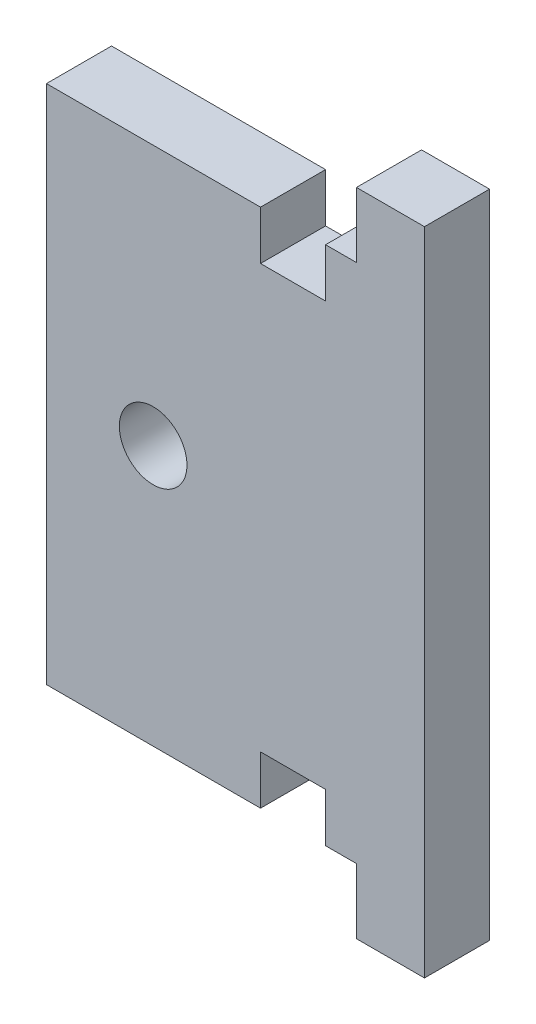
ISO-10303-21;
HEADER;
FILE_DESCRIPTION(('STEP AP214'),'2;1');
FILE_NAME('part.step','',(''),(''),'','','');
FILE_SCHEMA(('AUTOMOTIVE_DESIGN { 1 0 10303 214 1 1 1 1 }'));
ENDSEC;
DATA;
#1=APPLICATION_CONTEXT('core data for automotive mechanical design processes');
#2=APPLICATION_PROTOCOL_DEFINITION('international standard','automotive_design',2000,#1);
#3=PRODUCT_CONTEXT('',#1,'mechanical');
#4=PRODUCT('Part','Part','',(#3));
#5=PRODUCT_RELATED_PRODUCT_CATEGORY('part','',(#4));
#6=PRODUCT_DEFINITION_FORMATION('','',#4);
#7=PRODUCT_DEFINITION_CONTEXT('part definition',#1,'design');
#8=PRODUCT_DEFINITION('design','',#6,#7);
#9=PRODUCT_DEFINITION_SHAPE('','',#8);
#10=(LENGTH_UNIT() NAMED_UNIT(*) SI_UNIT(.MILLI.,.METRE.));
#11=(NAMED_UNIT(*) PLANE_ANGLE_UNIT() SI_UNIT($,.RADIAN.));
#12=(NAMED_UNIT(*) SI_UNIT($,.STERADIAN.) SOLID_ANGLE_UNIT());
#13=UNCERTAINTY_MEASURE_WITH_UNIT(LENGTH_MEASURE(1.E-05),#10,'distance_accuracy_value','');
#14=(GEOMETRIC_REPRESENTATION_CONTEXT(3) GLOBAL_UNCERTAINTY_ASSIGNED_CONTEXT((#13)) GLOBAL_UNIT_ASSIGNED_CONTEXT((#10,
#11,#12)) REPRESENTATION_CONTEXT('',''));
#15=CARTESIAN_POINT('',(0.,0.,0.));
#16=DIRECTION('',(0.,0.,1.));
#17=DIRECTION('',(1.,0.,0.));
#18=AXIS2_PLACEMENT_3D('',#15,#16,#17);
#19=CARTESIAN_POINT('',(0.,6.34999999999999,0.));
#20=DIRECTION('',(0.,1.,0.));
#21=DIRECTION('',(-1.,0.,0.));
#22=AXIS2_PLACEMENT_3D('',#19,#20,#21);
#23=PLANE('',#22);
#24=DIRECTION('',(-1.,0.,0.));
#25=VECTOR('',#24,1.);
#26=CARTESIAN_POINT('',(0.,6.34999999999999,6.35));
#27=LINE('',#26,#25);
#28=CARTESIAN_POINT('',(37.30625,6.34999999999999,6.35));
#29=VERTEX_POINT('',#28);
#30=CARTESIAN_POINT('',(34.2900000000002,6.35000000000222,6.35));
#31=VERTEX_POINT('',#30);
#32=EDGE_CURVE('E194',#29,#31,#27,.T.);
#33=ORIENTED_EDGE('',*,*,#32,.T.);
#34=DIRECTION('',(0.,0.,1.));
#35=VECTOR('',#34,1.);
#36=CARTESIAN_POINT('',(34.2900000000002,6.35000000000222,0.));
#37=LINE('',#36,#35);
#38=CARTESIAN_POINT('',(34.2900000000002,6.35000000000222,0.));
#39=VERTEX_POINT('',#38);
#40=EDGE_CURVE('E228',#39,#31,#37,.T.);
#41=ORIENTED_EDGE('',*,*,#40,.F.);
#42=DIRECTION('',(-1.,0.,0.));
#43=VECTOR('',#42,1.);
#44=CARTESIAN_POINT('',(0.,6.34999999999999,0.));
#45=LINE('',#44,#43);
#46=CARTESIAN_POINT('',(37.30625,6.34999999999999,0.));
#47=VERTEX_POINT('',#46);
#48=EDGE_CURVE('E188',#47,#39,#45,.T.);
#49=ORIENTED_EDGE('',*,*,#48,.F.);
#50=DIRECTION('',(0.,0.,1.));
#51=VECTOR('',#50,1.);
#52=CARTESIAN_POINT('',(37.30625,6.34999999999999,0.));
#53=LINE('',#52,#51);
#54=EDGE_CURVE('E187',#47,#29,#53,.T.);
#55=ORIENTED_EDGE('',*,*,#54,.T.);
#56=EDGE_LOOP('',(#33,#41,#49,#55));
#57=FACE_BOUND('',#56,.T.);
#58=ADVANCED_FACE('F33',(#57),#23,.F.);
#59=CARTESIAN_POINT('',(0.,57.1500000000035,0.));
#60=DIRECTION('',(0.,-1.,0.));
#61=DIRECTION('',(1.,0.,0.));
#62=AXIS2_PLACEMENT_3D('',#59,#60,#61);
#63=PLANE('',#62);
#64=DIRECTION('',(1.,0.,0.));
#65=VECTOR('',#64,1.);
#66=CARTESIAN_POINT('',(0.,57.1500000000035,0.));
#67=LINE('',#66,#65);
#68=CARTESIAN_POINT('',(34.2900000000002,57.1500000000034,0.));
#69=VERTEX_POINT('',#68);
#70=CARTESIAN_POINT('',(37.30625,57.1500000000035,0.));
#71=VERTEX_POINT('',#70);
#72=EDGE_CURVE('E213',#69,#71,#67,.T.);
#73=ORIENTED_EDGE('',*,*,#72,.F.);
#74=DIRECTION('',(0.,0.,1.));
#75=VECTOR('',#74,1.);
#76=CARTESIAN_POINT('',(34.2900000000002,57.1500000000034,0.));
#77=LINE('',#76,#75);
#78=CARTESIAN_POINT('',(34.2900000000002,57.1500000000034,6.35));
#79=VERTEX_POINT('',#78);
#80=EDGE_CURVE('E246',#69,#79,#77,.T.);
#81=ORIENTED_EDGE('',*,*,#80,.T.);
#82=DIRECTION('',(1.,0.,0.));
#83=VECTOR('',#82,1.);
#84=CARTESIAN_POINT('',(0.,57.1500000000035,6.35));
#85=LINE('',#84,#83);
#86=CARTESIAN_POINT('',(37.30625,57.1500000000035,6.35));
#87=VERTEX_POINT('',#86);
#88=EDGE_CURVE('E193',#79,#87,#85,.T.);
#89=ORIENTED_EDGE('',*,*,#88,.T.);
#90=DIRECTION('',(0.,0.,1.));
#91=VECTOR('',#90,1.);
#92=CARTESIAN_POINT('',(37.30625,57.1500000000035,0.));
#93=LINE('',#92,#91);
#94=EDGE_CURVE('E184',#71,#87,#93,.T.);
#95=ORIENTED_EDGE('',*,*,#94,.F.);
#96=EDGE_LOOP('',(#73,#81,#89,#95));
#97=FACE_BOUND('',#96,.T.);
#98=ADVANCED_FACE('F281',(#97),#63,.F.);
#99=CARTESIAN_POINT('',(0.,0.,6.35));
#100=DIRECTION('',(0.,1.,0.));
#101=DIRECTION('',(0.,0.,1.));
#102=AXIS2_PLACEMENT_3D('',#99,#100,#101);
#103=PLANE('',#102);
#104=DIRECTION('',(0.,0.,1.));
#105=VECTOR('',#104,1.);
#106=CARTESIAN_POINT('',(37.30625,0.,0.));
#107=LINE('',#106,#105);
#108=CARTESIAN_POINT('',(37.30625,0.,0.));
#109=VERTEX_POINT('',#108);
#110=CARTESIAN_POINT('',(37.30625,0.,6.35));
#111=VERTEX_POINT('',#110);
#112=EDGE_CURVE('E185',#109,#111,#107,.T.);
#113=ORIENTED_EDGE('',*,*,#112,.F.);
#114=DIRECTION('',(1.,0.,0.));
#115=VECTOR('',#114,1.);
#116=CARTESIAN_POINT('',(0.,0.,0.));
#117=LINE('',#116,#115);
#118=CARTESIAN_POINT('',(43.942,0.,0.));
#119=VERTEX_POINT('',#118);
#120=EDGE_CURVE('E167',#109,#119,#117,.T.);
#121=ORIENTED_EDGE('',*,*,#120,.T.);
#122=DIRECTION('',(0.,0.,-1.));
#123=VECTOR('',#122,1.);
#124=CARTESIAN_POINT('',(43.942,0.,6.35));
#125=LINE('',#124,#123);
#126=CARTESIAN_POINT('',(43.942,0.,6.35));
#127=VERTEX_POINT('',#126);
#128=EDGE_CURVE('E11',#127,#119,#125,.T.);
#129=ORIENTED_EDGE('',*,*,#128,.F.);
#130=DIRECTION('',(1.,0.,0.));
#131=VECTOR('',#130,1.);
#132=CARTESIAN_POINT('',(0.,0.,6.35));
#133=LINE('',#132,#131);
#134=EDGE_CURVE('E166',#111,#127,#133,.T.);
#135=ORIENTED_EDGE('',*,*,#134,.F.);
#136=EDGE_LOOP('',(#113,#121,#129,#135));
#137=FACE_BOUND('',#136,.T.);
#138=ADVANCED_FACE('F35',(#137),#103,.F.);
#139=CARTESIAN_POINT('',(0.,0.,6.35));
#140=DIRECTION('',(0.,0.,-1.));
#141=DIRECTION('',(-1.,0.,0.));
#142=AXIS2_PLACEMENT_3D('',#139,#140,#141);
#143=PLANE('',#142);
#144=CARTESIAN_POINT('',(17.4625000000023,31.7500000000036,6.35));
#145=DIRECTION('',(0.,0.,1.));
#146=DIRECTION('',(1.,0.,0.));
#147=AXIS2_PLACEMENT_3D('',#144,#145,#146);
#148=CIRCLE('',#147,3.29999999999999);
#149=CARTESIAN_POINT('',(20.7625000000023,31.7500000000036,6.35));
#150=VERTEX_POINT('',#149);
#151=EDGE_CURVE('E175',#150,#150,#148,.T.);
#152=ORIENTED_EDGE('',*,*,#151,.F.);
#153=EDGE_LOOP('',(#152));
#154=FACE_BOUND('',#153,.T.);
#155=DIRECTION('',(0.,1.,0.));
#156=VECTOR('',#155,1.);
#157=CARTESIAN_POINT('',(43.942,0.,6.35));
#158=LINE('',#157,#156);
#159=CARTESIAN_POINT('',(43.942,63.5,6.35));
#160=VERTEX_POINT('',#159);
#161=EDGE_CURVE('E41',#127,#160,#158,.T.);
#162=ORIENTED_EDGE('',*,*,#161,.T.);
#163=DIRECTION('',(-1.,0.,0.));
#164=VECTOR('',#163,1.);
#165=CARTESIAN_POINT('',(0.,63.5,6.35));
#166=LINE('',#165,#164);
#167=CARTESIAN_POINT('',(37.30625,63.5,6.35));
#168=VERTEX_POINT('',#167);
#169=EDGE_CURVE('E147',#160,#168,#166,.T.);
#170=ORIENTED_EDGE('',*,*,#169,.T.);
#171=DIRECTION('',(0.,-1.,0.));
#172=VECTOR('',#171,1.);
#173=CARTESIAN_POINT('',(37.30625,0.,6.35));
#174=LINE('',#173,#172);
#175=EDGE_CURVE('E211',#168,#87,#174,.T.);
#176=ORIENTED_EDGE('',*,*,#175,.T.);
#177=ORIENTED_EDGE('',*,*,#88,.F.);
#178=DIRECTION('',(0.,1.,0.));
#179=VECTOR('',#178,1.);
#180=CARTESIAN_POINT('',(34.2900000000002,57.1500000000034,6.35));
#181=LINE('',#180,#179);
#182=CARTESIAN_POINT('',(34.2900000000002,52.3875000000034,6.35));
#183=VERTEX_POINT('',#182);
#184=EDGE_CURVE('E230',#183,#79,#181,.T.);
#185=ORIENTED_EDGE('',*,*,#184,.F.);
#186=DIRECTION('',(1.,0.,0.));
#187=VECTOR('',#186,1.);
#188=CARTESIAN_POINT('',(34.2900000000002,52.3875000000034,6.35));
#189=LINE('',#188,#187);
#190=CARTESIAN_POINT('',(27.9400000000002,52.3875000000034,6.35));
#191=VERTEX_POINT('',#190);
#192=EDGE_CURVE('E255',#191,#183,#189,.T.);
#193=ORIENTED_EDGE('',*,*,#192,.F.);
#194=DIRECTION('',(0.,-1.,0.));
#195=VECTOR('',#194,1.);
#196=CARTESIAN_POINT('',(27.9400000000002,57.1500000000034,6.35));
#197=LINE('',#196,#195);
#198=CARTESIAN_POINT('',(27.9400000000002,57.1500000000034,6.35));
#199=VERTEX_POINT('',#198);
#200=EDGE_CURVE('E259',#199,#191,#197,.T.);
#201=ORIENTED_EDGE('',*,*,#200,.F.);
#202=CARTESIAN_POINT('',(7.05050000000001,57.1500000000035,6.35));
#203=VERTEX_POINT('',#202);
#204=EDGE_CURVE('E214',#203,#199,#85,.T.);
#205=ORIENTED_EDGE('',*,*,#204,.F.);
#206=DIRECTION('',(0.,1.,0.));
#207=VECTOR('',#206,1.);
#208=CARTESIAN_POINT('',(7.05050000000002,0.,6.35));
#209=LINE('',#208,#207);
#210=CARTESIAN_POINT('',(7.05050000000002,6.34999999999999,6.35));
#211=VERTEX_POINT('',#210);
#212=EDGE_CURVE('E178',#211,#203,#209,.T.);
#213=ORIENTED_EDGE('',*,*,#212,.F.);
#214=CARTESIAN_POINT('',(27.9400000000002,6.34999999999999,6.35));
#215=VERTEX_POINT('',#214);
#216=EDGE_CURVE('E198',#215,#211,#27,.T.);
#217=ORIENTED_EDGE('',*,*,#216,.F.);
#218=DIRECTION('',(0.,-1.,0.));
#219=VECTOR('',#218,1.);
#220=CARTESIAN_POINT('',(27.9400000000002,11.1125000000022,6.35));
#221=LINE('',#220,#219);
#222=CARTESIAN_POINT('',(27.9400000000002,11.1125000000022,6.35));
#223=VERTEX_POINT('',#222);
#224=EDGE_CURVE('E56',#223,#215,#221,.T.);
#225=ORIENTED_EDGE('',*,*,#224,.F.);
#226=DIRECTION('',(-1.,0.,0.));
#227=VECTOR('',#226,1.);
#228=CARTESIAN_POINT('',(34.2900000000002,11.1125000000022,6.35));
#229=LINE('',#228,#227);
#230=CARTESIAN_POINT('',(34.2900000000002,11.1125000000022,6.35));
#231=VERTEX_POINT('',#230);
#232=EDGE_CURVE('E233',#231,#223,#229,.T.);
#233=ORIENTED_EDGE('',*,*,#232,.F.);
#234=DIRECTION('',(0.,1.,0.));
#235=VECTOR('',#234,1.);
#236=CARTESIAN_POINT('',(34.2900000000002,11.1125000000022,6.35));
#237=LINE('',#236,#235);
#238=EDGE_CURVE('E236',#31,#231,#237,.T.);
#239=ORIENTED_EDGE('',*,*,#238,.F.);
#240=ORIENTED_EDGE('',*,*,#32,.F.);
#241=DIRECTION('',(0.,-1.,0.));
#242=VECTOR('',#241,1.);
#243=CARTESIAN_POINT('',(37.30625,0.,6.35));
#244=LINE('',#243,#242);
#245=EDGE_CURVE('E199',#29,#111,#244,.T.);
#246=ORIENTED_EDGE('',*,*,#245,.T.);
#247=ORIENTED_EDGE('',*,*,#134,.T.);
#248=EDGE_LOOP('',(#162,#170,#176,#177,#185,#193,#201,#205,#213,#217,#225,#233,#239,#240,#246,#247));
#249=FACE_BOUND('',#248,.T.);
#250=ADVANCED_FACE('F274',(#154,#249),#143,.F.);
#251=CARTESIAN_POINT('',(0.,0.,0.));
#252=DIRECTION('',(0.,0.,-1.));
#253=DIRECTION('',(-1.,0.,0.));
#254=AXIS2_PLACEMENT_3D('',#251,#252,#253);
#255=PLANE('',#254);
#256=DIRECTION('',(1.,0.,0.));
#257=VECTOR('',#256,1.);
#258=CARTESIAN_POINT('',(0.,63.5,0.));
#259=LINE('',#258,#257);
#260=CARTESIAN_POINT('',(37.30625,63.5,0.));
#261=VERTEX_POINT('',#260);
#262=CARTESIAN_POINT('',(43.942,63.5,0.));
#263=VERTEX_POINT('',#262);
#264=EDGE_CURVE('E48',#261,#263,#259,.T.);
#265=ORIENTED_EDGE('',*,*,#264,.T.);
#266=DIRECTION('',(0.,1.,0.));
#267=VECTOR('',#266,1.);
#268=CARTESIAN_POINT('',(43.942,0.,0.));
#269=LINE('',#268,#267);
#270=EDGE_CURVE('E160',#119,#263,#269,.T.);
#271=ORIENTED_EDGE('',*,*,#270,.F.);
#272=ORIENTED_EDGE('',*,*,#120,.F.);
#273=DIRECTION('',(0.,-1.,0.));
#274=VECTOR('',#273,1.);
#275=CARTESIAN_POINT('',(37.30625,0.,0.));
#276=LINE('',#275,#274);
#277=EDGE_CURVE('E197',#47,#109,#276,.T.);
#278=ORIENTED_EDGE('',*,*,#277,.F.);
#279=ORIENTED_EDGE('',*,*,#48,.T.);
#280=DIRECTION('',(0.,1.,0.));
#281=VECTOR('',#280,1.);
#282=CARTESIAN_POINT('',(34.2900000000002,11.1125000000022,0.));
#283=LINE('',#282,#281);
#284=CARTESIAN_POINT('',(34.2900000000002,11.1125000000022,0.));
#285=VERTEX_POINT('',#284);
#286=EDGE_CURVE('E232',#39,#285,#283,.T.);
#287=ORIENTED_EDGE('',*,*,#286,.T.);
#288=DIRECTION('',(-1.,0.,0.));
#289=VECTOR('',#288,1.);
#290=CARTESIAN_POINT('',(34.2900000000002,11.1125000000022,0.));
#291=LINE('',#290,#289);
#292=CARTESIAN_POINT('',(27.9400000000002,11.1125000000022,0.));
#293=VERTEX_POINT('',#292);
#294=EDGE_CURVE('E241',#285,#293,#291,.T.);
#295=ORIENTED_EDGE('',*,*,#294,.T.);
#296=DIRECTION('',(0.,-1.,0.));
#297=VECTOR('',#296,1.);
#298=CARTESIAN_POINT('',(27.9400000000002,11.1125000000022,0.));
#299=LINE('',#298,#297);
#300=CARTESIAN_POINT('',(27.9400000000002,6.35000000000221,0.));
#301=VERTEX_POINT('',#300);
#302=EDGE_CURVE('E224',#293,#301,#299,.T.);
#303=ORIENTED_EDGE('',*,*,#302,.T.);
#304=CARTESIAN_POINT('',(7.05050000000002,6.34999999999999,0.));
#305=VERTEX_POINT('',#304);
#306=EDGE_CURVE('E205',#301,#305,#45,.T.);
#307=ORIENTED_EDGE('',*,*,#306,.T.);
#308=DIRECTION('',(0.,-1.,0.));
#309=VECTOR('',#308,1.);
#310=CARTESIAN_POINT('',(7.05050000000002,0.,0.));
#311=LINE('',#310,#309);
#312=CARTESIAN_POINT('',(7.05050000000001,57.1500000000035,0.));
#313=VERTEX_POINT('',#312);
#314=EDGE_CURVE('E181',#313,#305,#311,.T.);
#315=ORIENTED_EDGE('',*,*,#314,.F.);
#316=CARTESIAN_POINT('',(27.9400000000002,57.1500000000035,0.));
#317=VERTEX_POINT('',#316);
#318=EDGE_CURVE('E218',#313,#317,#67,.T.);
#319=ORIENTED_EDGE('',*,*,#318,.T.);
#320=DIRECTION('',(0.,-1.,0.));
#321=VECTOR('',#320,1.);
#322=CARTESIAN_POINT('',(27.9400000000002,57.1500000000034,0.));
#323=LINE('',#322,#321);
#324=CARTESIAN_POINT('',(27.9400000000002,52.3875000000034,0.));
#325=VERTEX_POINT('',#324);
#326=EDGE_CURVE('E265',#317,#325,#323,.T.);
#327=ORIENTED_EDGE('',*,*,#326,.T.);
#328=DIRECTION('',(1.,0.,0.));
#329=VECTOR('',#328,1.);
#330=CARTESIAN_POINT('',(34.2900000000002,52.3875000000034,0.));
#331=LINE('',#330,#329);
#332=CARTESIAN_POINT('',(34.2900000000002,52.3875000000034,0.));
#333=VERTEX_POINT('',#332);
#334=EDGE_CURVE('E250',#325,#333,#331,.T.);
#335=ORIENTED_EDGE('',*,*,#334,.T.);
#336=DIRECTION('',(0.,1.,0.));
#337=VECTOR('',#336,1.);
#338=CARTESIAN_POINT('',(34.2900000000002,57.1500000000034,0.));
#339=LINE('',#338,#337);
#340=EDGE_CURVE('E258',#333,#69,#339,.T.);
#341=ORIENTED_EDGE('',*,*,#340,.T.);
#342=ORIENTED_EDGE('',*,*,#72,.T.);
#343=DIRECTION('',(0.,-1.,0.));
#344=VECTOR('',#343,1.);
#345=CARTESIAN_POINT('',(37.30625,0.,0.));
#346=LINE('',#345,#344);
#347=EDGE_CURVE('E162',#261,#71,#346,.T.);
#348=ORIENTED_EDGE('',*,*,#347,.F.);
#349=EDGE_LOOP('',(#265,#271,#272,#278,#279,#287,#295,#303,#307,#315,#319,#327,#335,#341,#342,#348));
#350=FACE_BOUND('',#349,.T.);
#351=CARTESIAN_POINT('',(17.4625000000023,31.7500000000036,0.));
#352=DIRECTION('',(0.,0.,1.));
#353=DIRECTION('',(1.,0.,0.));
#354=AXIS2_PLACEMENT_3D('',#351,#352,#353);
#355=CIRCLE('',#354,3.3);
#356=CARTESIAN_POINT('',(20.7625000000023,31.7500000000036,0.));
#357=VERTEX_POINT('',#356);
#358=EDGE_CURVE('E169',#357,#357,#355,.T.);
#359=ORIENTED_EDGE('',*,*,#358,.T.);
#360=EDGE_LOOP('',(#359));
#361=FACE_BOUND('',#360,.T.);
#362=ADVANCED_FACE('F157',(#350,#361),#255,.T.);
#363=CARTESIAN_POINT('',(43.942,0.,6.35));
#364=DIRECTION('',(-1.,0.,0.));
#365=DIRECTION('',(0.,0.,1.));
#366=AXIS2_PLACEMENT_3D('',#363,#364,#365);
#367=PLANE('',#366);
#368=ORIENTED_EDGE('',*,*,#270,.T.);
#369=DIRECTION('',(0.,0.,1.));
#370=VECTOR('',#369,1.);
#371=CARTESIAN_POINT('',(43.942,63.5,0.));
#372=LINE('',#371,#370);
#373=EDGE_CURVE('E144',#263,#160,#372,.T.);
#374=ORIENTED_EDGE('',*,*,#373,.T.);
#375=ORIENTED_EDGE('',*,*,#161,.F.);
#376=ORIENTED_EDGE('',*,*,#128,.T.);
#377=EDGE_LOOP('',(#368,#374,#375,#376));
#378=FACE_BOUND('',#377,.T.);
#379=ADVANCED_FACE('F164',(#378),#367,.F.);
#380=CARTESIAN_POINT('',(17.4625000000023,31.7500000000036,6.35));
#381=DIRECTION('',(0.,0.,1.));
#382=DIRECTION('',(1.,0.,0.));
#383=AXIS2_PLACEMENT_3D('',#380,#381,#382);
#384=CYLINDRICAL_SURFACE('',#383,3.29999999999999);
#385=ORIENTED_EDGE('',*,*,#358,.F.);
#386=EDGE_LOOP('',(#385));
#387=FACE_BOUND('',#386,.T.);
#388=ORIENTED_EDGE('',*,*,#151,.T.);
#389=EDGE_LOOP('',(#388));
#390=FACE_BOUND('',#389,.T.);
#391=ADVANCED_FACE('F344',(#387,#390),#384,.F.);
#392=CARTESIAN_POINT('',(7.05050000000002,0.,0.));
#393=DIRECTION('',(-1.,0.,0.));
#394=DIRECTION('',(0.,-1.,0.));
#395=AXIS2_PLACEMENT_3D('',#392,#393,#394);
#396=PLANE('',#395);
#397=DIRECTION('',(0.,0.,1.));
#398=VECTOR('',#397,1.);
#399=CARTESIAN_POINT('',(7.05050000000001,57.1500000000035,0.));
#400=LINE('',#399,#398);
#401=EDGE_CURVE('E207',#313,#203,#400,.T.);
#402=ORIENTED_EDGE('',*,*,#401,.F.);
#403=ORIENTED_EDGE('',*,*,#314,.T.);
#404=DIRECTION('',(0.,0.,1.));
#405=VECTOR('',#404,1.);
#406=CARTESIAN_POINT('',(7.05050000000002,6.34999999999999,0.));
#407=LINE('',#406,#405);
#408=EDGE_CURVE('E190',#305,#211,#407,.T.);
#409=ORIENTED_EDGE('',*,*,#408,.T.);
#410=ORIENTED_EDGE('',*,*,#212,.T.);
#411=EDGE_LOOP('',(#402,#403,#409,#410));
#412=FACE_BOUND('',#411,.T.);
#413=ADVANCED_FACE('F301',(#412),#396,.T.);
#414=ORIENTED_EDGE('',*,*,#306,.F.);
#415=DIRECTION('',(0.,0.,1.));
#416=VECTOR('',#415,1.);
#417=CARTESIAN_POINT('',(27.9400000000002,6.35000000000221,0.));
#418=LINE('',#417,#416);
#419=EDGE_CURVE('E226',#301,#215,#418,.T.);
#420=ORIENTED_EDGE('',*,*,#419,.T.);
#421=ORIENTED_EDGE('',*,*,#216,.T.);
#422=ORIENTED_EDGE('',*,*,#408,.F.);
#423=EDGE_LOOP('',(#414,#420,#421,#422));
#424=FACE_BOUND('',#423,.T.);
#425=ADVANCED_FACE('F306',(#424),#23,.F.);
#426=CARTESIAN_POINT('',(37.30625,0.,0.));
#427=DIRECTION('',(-1.,0.,0.));
#428=DIRECTION('',(0.,-1.,0.));
#429=AXIS2_PLACEMENT_3D('',#426,#427,#428);
#430=PLANE('',#429);
#431=ORIENTED_EDGE('',*,*,#245,.F.);
#432=ORIENTED_EDGE('',*,*,#54,.F.);
#433=ORIENTED_EDGE('',*,*,#277,.T.);
#434=ORIENTED_EDGE('',*,*,#112,.T.);
#435=EDGE_LOOP('',(#431,#432,#433,#434));
#436=FACE_BOUND('',#435,.T.);
#437=ADVANCED_FACE('F323',(#436),#430,.T.);
#438=CARTESIAN_POINT('',(37.30625,0.,0.));
#439=DIRECTION('',(-1.,0.,0.));
#440=DIRECTION('',(0.,-1.,0.));
#441=AXIS2_PLACEMENT_3D('',#438,#439,#440);
#442=PLANE('',#441);
#443=DIRECTION('',(0.,0.,1.));
#444=VECTOR('',#443,1.);
#445=CARTESIAN_POINT('',(37.30625,63.5,0.));
#446=LINE('',#445,#444);
#447=EDGE_CURVE('E152',#261,#168,#446,.T.);
#448=ORIENTED_EDGE('',*,*,#447,.F.);
#449=ORIENTED_EDGE('',*,*,#347,.T.);
#450=ORIENTED_EDGE('',*,*,#94,.T.);
#451=ORIENTED_EDGE('',*,*,#175,.F.);
#452=EDGE_LOOP('',(#448,#449,#450,#451));
#453=FACE_BOUND('',#452,.T.);
#454=ADVANCED_FACE('F277',(#453),#442,.T.);
#455=ORIENTED_EDGE('',*,*,#204,.T.);
#456=DIRECTION('',(0.,0.,1.));
#457=VECTOR('',#456,1.);
#458=CARTESIAN_POINT('',(27.9400000000002,57.1500000000034,0.));
#459=LINE('',#458,#457);
#460=EDGE_CURVE('E249',#317,#199,#459,.T.);
#461=ORIENTED_EDGE('',*,*,#460,.F.);
#462=ORIENTED_EDGE('',*,*,#318,.F.);
#463=ORIENTED_EDGE('',*,*,#401,.T.);
#464=EDGE_LOOP('',(#455,#461,#462,#463));
#465=FACE_BOUND('',#464,.T.);
#466=ADVANCED_FACE('F297',(#465),#63,.F.);
#467=CARTESIAN_POINT('',(34.2900000000002,57.1500000000034,0.));
#468=DIRECTION('',(1.,0.,0.));
#469=DIRECTION('',(0.,0.,-1.));
#470=AXIS2_PLACEMENT_3D('',#467,#468,#469);
#471=PLANE('',#470);
#472=ORIENTED_EDGE('',*,*,#184,.T.);
#473=ORIENTED_EDGE('',*,*,#80,.F.);
#474=ORIENTED_EDGE('',*,*,#340,.F.);
#475=DIRECTION('',(0.,0.,1.));
#476=VECTOR('',#475,1.);
#477=CARTESIAN_POINT('',(34.2900000000002,52.3875000000034,0.));
#478=LINE('',#477,#476);
#479=EDGE_CURVE('E202',#333,#183,#478,.T.);
#480=ORIENTED_EDGE('',*,*,#479,.T.);
#481=EDGE_LOOP('',(#472,#473,#474,#480));
#482=FACE_BOUND('',#481,.T.);
#483=ADVANCED_FACE('F286',(#482),#471,.F.);
#484=CARTESIAN_POINT('',(34.2900000000002,52.3875000000034,0.));
#485=DIRECTION('',(0.,-1.,0.));
#486=DIRECTION('',(0.,0.,-1.));
#487=AXIS2_PLACEMENT_3D('',#484,#485,#486);
#488=PLANE('',#487);
#489=ORIENTED_EDGE('',*,*,#192,.T.);
#490=ORIENTED_EDGE('',*,*,#479,.F.);
#491=ORIENTED_EDGE('',*,*,#334,.F.);
#492=DIRECTION('',(0.,0.,1.));
#493=VECTOR('',#492,1.);
#494=CARTESIAN_POINT('',(27.9400000000002,52.3875000000034,0.));
#495=LINE('',#494,#493);
#496=EDGE_CURVE('E252',#325,#191,#495,.T.);
#497=ORIENTED_EDGE('',*,*,#496,.T.);
#498=EDGE_LOOP('',(#489,#490,#491,#497));
#499=FACE_BOUND('',#498,.T.);
#500=ADVANCED_FACE('F290',(#499),#488,.F.);
#501=CARTESIAN_POINT('',(27.9400000000002,57.1500000000034,0.));
#502=DIRECTION('',(-1.,0.,0.));
#503=DIRECTION('',(0.,0.,1.));
#504=AXIS2_PLACEMENT_3D('',#501,#502,#503);
#505=PLANE('',#504);
#506=ORIENTED_EDGE('',*,*,#200,.T.);
#507=ORIENTED_EDGE('',*,*,#496,.F.);
#508=ORIENTED_EDGE('',*,*,#326,.F.);
#509=ORIENTED_EDGE('',*,*,#460,.T.);
#510=EDGE_LOOP('',(#506,#507,#508,#509));
#511=FACE_BOUND('',#510,.T.);
#512=ADVANCED_FACE('F292',(#511),#505,.F.);
#513=CARTESIAN_POINT('',(34.2900000000002,11.1125000000022,0.));
#514=DIRECTION('',(1.,0.,0.));
#515=DIRECTION('',(0.,0.,-1.));
#516=AXIS2_PLACEMENT_3D('',#513,#514,#515);
#517=PLANE('',#516);
#518=ORIENTED_EDGE('',*,*,#238,.T.);
#519=DIRECTION('',(0.,0.,1.));
#520=VECTOR('',#519,1.);
#521=CARTESIAN_POINT('',(34.2900000000002,11.1125000000022,0.));
#522=LINE('',#521,#520);
#523=EDGE_CURVE('E221',#285,#231,#522,.T.);
#524=ORIENTED_EDGE('',*,*,#523,.F.);
#525=ORIENTED_EDGE('',*,*,#286,.F.);
#526=ORIENTED_EDGE('',*,*,#40,.T.);
#527=EDGE_LOOP('',(#518,#524,#525,#526));
#528=FACE_BOUND('',#527,.T.);
#529=ADVANCED_FACE('F315',(#528),#517,.F.);
#530=CARTESIAN_POINT('',(27.9400000000002,11.1125000000022,0.));
#531=DIRECTION('',(-1.,0.,0.));
#532=DIRECTION('',(0.,0.,1.));
#533=AXIS2_PLACEMENT_3D('',#530,#531,#532);
#534=PLANE('',#533);
#535=ORIENTED_EDGE('',*,*,#224,.T.);
#536=ORIENTED_EDGE('',*,*,#419,.F.);
#537=ORIENTED_EDGE('',*,*,#302,.F.);
#538=DIRECTION('',(0.,0.,1.));
#539=VECTOR('',#538,1.);
#540=CARTESIAN_POINT('',(27.9400000000002,11.1125000000022,0.));
#541=LINE('',#540,#539);
#542=EDGE_CURVE('E223',#293,#223,#541,.T.);
#543=ORIENTED_EDGE('',*,*,#542,.T.);
#544=EDGE_LOOP('',(#535,#536,#537,#543));
#545=FACE_BOUND('',#544,.T.);
#546=ADVANCED_FACE('F435',(#545),#534,.F.);
#547=CARTESIAN_POINT('',(34.2900000000002,11.1125000000022,0.));
#548=DIRECTION('',(0.,1.,0.));
#549=DIRECTION('',(0.,0.,1.));
#550=AXIS2_PLACEMENT_3D('',#547,#548,#549);
#551=PLANE('',#550);
#552=ORIENTED_EDGE('',*,*,#232,.T.);
#553=ORIENTED_EDGE('',*,*,#542,.F.);
#554=ORIENTED_EDGE('',*,*,#294,.F.);
#555=ORIENTED_EDGE('',*,*,#523,.T.);
#556=EDGE_LOOP('',(#552,#553,#554,#555));
#557=FACE_BOUND('',#556,.T.);
#558=ADVANCED_FACE('F312',(#557),#551,.F.);
#559=CARTESIAN_POINT('',(0.,63.5,0.));
#560=DIRECTION('',(0.,-1.,0.));
#561=DIRECTION('',(0.,0.,-1.));
#562=AXIS2_PLACEMENT_3D('',#559,#560,#561);
#563=PLANE('',#562);
#564=ORIENTED_EDGE('',*,*,#373,.F.);
#565=ORIENTED_EDGE('',*,*,#264,.F.);
#566=ORIENTED_EDGE('',*,*,#447,.T.);
#567=ORIENTED_EDGE('',*,*,#169,.F.);
#568=EDGE_LOOP('',(#564,#565,#566,#567));
#569=FACE_BOUND('',#568,.T.);
#570=ADVANCED_FACE('F145',(#569),#563,.F.);
#571=CLOSED_SHELL('',(#58,#98,#138,#250,#362,#379,#391,#413,#425,#437,#454,#466,#483,#500,#512,
#529,#546,#558,#570));
#572=MANIFOLD_SOLID_BREP('B2',#571);
#573=ADVANCED_BREP_SHAPE_REPRESENTATION('',(#18,#572),#14);
#574=SHAPE_DEFINITION_REPRESENTATION(#9,#573);
ENDSEC;
END-ISO-10303-21;
